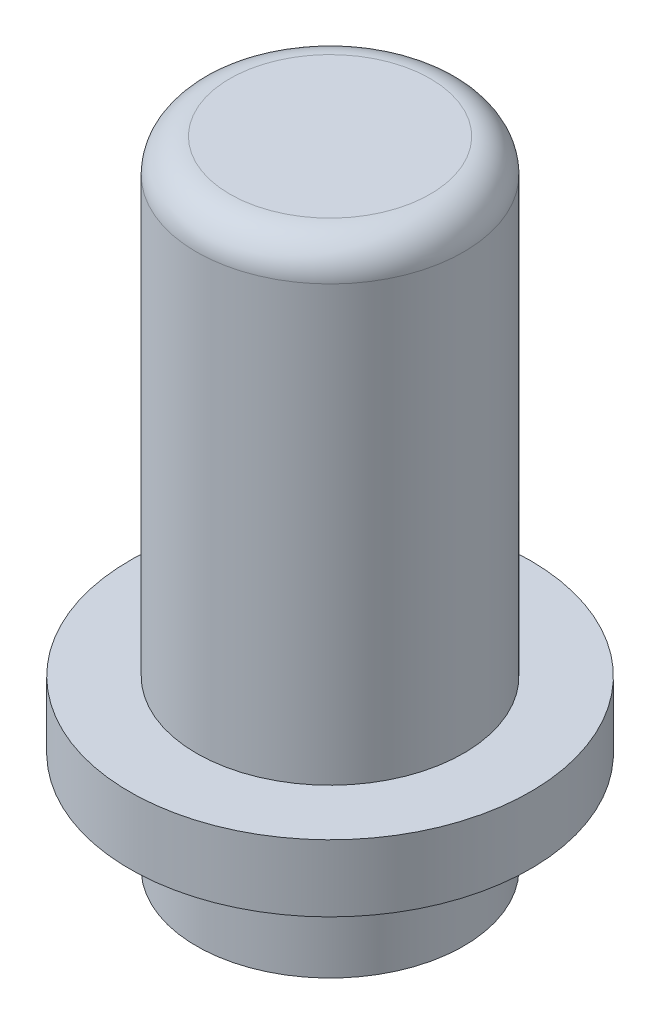
ISO-10303-21;
HEADER;
FILE_DESCRIPTION(('STEP AP214'),'2;1');
FILE_NAME('part.step','',(''),(''),'','','');
FILE_SCHEMA(('AUTOMOTIVE_DESIGN { 1 0 10303 214 1 1 1 1 }'));
ENDSEC;
DATA;
#1=APPLICATION_CONTEXT('core data for automotive mechanical design processes');
#2=APPLICATION_PROTOCOL_DEFINITION('international standard','automotive_design',2000,#1);
#3=PRODUCT_CONTEXT('',#1,'mechanical');
#4=PRODUCT('Part','Part','',(#3));
#5=PRODUCT_RELATED_PRODUCT_CATEGORY('part','',(#4));
#6=PRODUCT_DEFINITION_FORMATION('','',#4);
#7=PRODUCT_DEFINITION_CONTEXT('part definition',#1,'design');
#8=PRODUCT_DEFINITION('design','',#6,#7);
#9=PRODUCT_DEFINITION_SHAPE('','',#8);
#10=(LENGTH_UNIT() NAMED_UNIT(*) SI_UNIT(.MILLI.,.METRE.));
#11=(NAMED_UNIT(*) PLANE_ANGLE_UNIT() SI_UNIT($,.RADIAN.));
#12=(NAMED_UNIT(*) SI_UNIT($,.STERADIAN.) SOLID_ANGLE_UNIT());
#13=UNCERTAINTY_MEASURE_WITH_UNIT(LENGTH_MEASURE(1.E-05),#10,'distance_accuracy_value','');
#14=(GEOMETRIC_REPRESENTATION_CONTEXT(3) GLOBAL_UNCERTAINTY_ASSIGNED_CONTEXT((#13)) GLOBAL_UNIT_ASSIGNED_CONTEXT((#10,
#11,#12)) REPRESENTATION_CONTEXT('',''));
#15=CARTESIAN_POINT('',(0.,0.,0.));
#16=DIRECTION('',(0.,0.,1.));
#17=DIRECTION('',(1.,0.,0.));
#18=AXIS2_PLACEMENT_3D('',#15,#16,#17);
#19=CARTESIAN_POINT('',(0.,6.5,0.));
#20=DIRECTION('',(0.,1.,0.));
#21=DIRECTION('',(0.,0.,1.));
#22=AXIS2_PLACEMENT_3D('',#19,#20,#21);
#23=TOROIDAL_SURFACE('',#22,1.5,0.5);
#24=CARTESIAN_POINT('',(0.,7.,0.));
#25=DIRECTION('',(0.,1.,0.));
#26=DIRECTION('',(0.,0.,1.));
#27=AXIS2_PLACEMENT_3D('',#24,#25,#26);
#28=CIRCLE('',#27,1.5);
#29=CARTESIAN_POINT('',(0.,7.,1.5));
#30=VERTEX_POINT('',#29);
#31=EDGE_CURVE('E152',#30,#30,#28,.T.);
#32=ORIENTED_EDGE('',*,*,#31,.F.);
#33=EDGE_LOOP('',(#32));
#34=FACE_BOUND('',#33,.T.);
#35=CARTESIAN_POINT('',(0.,6.5,0.));
#36=DIRECTION('',(0.,1.,0.));
#37=DIRECTION('',(0.,0.,1.));
#38=AXIS2_PLACEMENT_3D('',#35,#36,#37);
#39=CIRCLE('',#38,2.);
#40=CARTESIAN_POINT('',(0.,6.5,2.));
#41=VERTEX_POINT('',#40);
#42=EDGE_CURVE('E37',#41,#41,#39,.F.);
#43=ORIENTED_EDGE('',*,*,#42,.F.);
#44=EDGE_LOOP('',(#43));
#45=FACE_BOUND('',#44,.T.);
#46=ADVANCED_FACE('F34',(#34,#45),#23,.T.);
#47=CARTESIAN_POINT('',(0.,7.,0.));
#48=DIRECTION('',(0.,-1.,0.));
#49=DIRECTION('',(0.,0.,-1.));
#50=AXIS2_PLACEMENT_3D('',#47,#48,#49);
#51=CYLINDRICAL_SURFACE('',#50,2.);
#52=ORIENTED_EDGE('',*,*,#42,.T.);
#53=EDGE_LOOP('',(#52));
#54=FACE_BOUND('',#53,.T.);
#55=CARTESIAN_POINT('',(0.,0.,0.));
#56=DIRECTION('',(0.,1.,0.));
#57=DIRECTION('',(0.,0.,1.));
#58=AXIS2_PLACEMENT_3D('',#55,#56,#57);
#59=CIRCLE('',#58,2.);
#60=CARTESIAN_POINT('',(0.,0.,2.));
#61=VERTEX_POINT('',#60);
#62=EDGE_CURVE('E148',#61,#61,#59,.T.);
#63=ORIENTED_EDGE('',*,*,#62,.T.);
#64=EDGE_LOOP('',(#63));
#65=FACE_BOUND('',#64,.T.);
#66=ADVANCED_FACE('F159',(#54,#65),#51,.T.);
#67=CARTESIAN_POINT('',(0.,7.,0.));
#68=DIRECTION('',(0.,1.,0.));
#69=DIRECTION('',(0.,0.,1.));
#70=AXIS2_PLACEMENT_3D('',#67,#68,#69);
#71=PLANE('',#70);
#72=ORIENTED_EDGE('',*,*,#31,.T.);
#73=EDGE_LOOP('',(#72));
#74=FACE_BOUND('',#73,.T.);
#75=ADVANCED_FACE('F167',(#74),#71,.T.);
#76=CARTESIAN_POINT('',(0.,-1.,0.));
#77=DIRECTION('',(0.,1.,0.));
#78=DIRECTION('',(0.,0.,1.));
#79=AXIS2_PLACEMENT_3D('',#76,#77,#78);
#80=CYLINDRICAL_SURFACE('',#79,3.);
#81=CARTESIAN_POINT('',(0.,-1.,0.));
#82=DIRECTION('',(0.,-1.,0.));
#83=DIRECTION('',(0.,0.,-1.));
#84=AXIS2_PLACEMENT_3D('',#81,#82,#83);
#85=CIRCLE('',#84,3.);
#86=CARTESIAN_POINT('',(0.,-1.,-3.));
#87=VERTEX_POINT('',#86);
#88=EDGE_CURVE('E145',#87,#87,#85,.T.);
#89=ORIENTED_EDGE('',*,*,#88,.F.);
#90=EDGE_LOOP('',(#89));
#91=FACE_BOUND('',#90,.T.);
#92=CARTESIAN_POINT('',(0.,0.,0.));
#93=DIRECTION('',(0.,-1.,0.));
#94=DIRECTION('',(0.,0.,-1.));
#95=AXIS2_PLACEMENT_3D('',#92,#93,#94);
#96=CIRCLE('',#95,3.);
#97=CARTESIAN_POINT('',(0.,0.,-3.));
#98=VERTEX_POINT('',#97);
#99=EDGE_CURVE('E143',#98,#98,#96,.T.);
#100=ORIENTED_EDGE('',*,*,#99,.T.);
#101=EDGE_LOOP('',(#100));
#102=FACE_BOUND('',#101,.T.);
#103=ADVANCED_FACE('F171',(#91,#102),#80,.T.);
#104=CARTESIAN_POINT('',(0.,-1.,0.));
#105=DIRECTION('',(0.,-1.,0.));
#106=DIRECTION('',(0.,0.,-1.));
#107=AXIS2_PLACEMENT_3D('',#104,#105,#106);
#108=PLANE('',#107);
#109=CARTESIAN_POINT('',(0.,-1.,0.));
#110=DIRECTION('',(0.,-1.,0.));
#111=DIRECTION('',(0.,0.,-1.));
#112=AXIS2_PLACEMENT_3D('',#109,#110,#111);
#113=CIRCLE('',#112,2.);
#114=CARTESIAN_POINT('',(0.,-1.,-2.));
#115=VERTEX_POINT('',#114);
#116=EDGE_CURVE('E11',#115,#115,#113,.T.);
#117=ORIENTED_EDGE('',*,*,#116,.F.);
#118=EDGE_LOOP('',(#117));
#119=FACE_BOUND('',#118,.T.);
#120=ORIENTED_EDGE('',*,*,#88,.T.);
#121=EDGE_LOOP('',(#120));
#122=FACE_BOUND('',#121,.T.);
#123=ADVANCED_FACE('F176',(#119,#122),#108,.T.);
#124=CARTESIAN_POINT('',(0.,0.,0.));
#125=DIRECTION('',(0.,-1.,0.));
#126=DIRECTION('',(0.,0.,-1.));
#127=AXIS2_PLACEMENT_3D('',#124,#125,#126);
#128=PLANE('',#127);
#129=ORIENTED_EDGE('',*,*,#62,.F.);
#130=EDGE_LOOP('',(#129));
#131=FACE_BOUND('',#130,.T.);
#132=ORIENTED_EDGE('',*,*,#99,.F.);
#133=EDGE_LOOP('',(#132));
#134=FACE_BOUND('',#133,.T.);
#135=ADVANCED_FACE('F178',(#131,#134),#128,.F.);
#136=CARTESIAN_POINT('',(0.,-2.5,0.));
#137=DIRECTION('',(0.,1.,0.));
#138=DIRECTION('',(0.,0.,1.));
#139=AXIS2_PLACEMENT_3D('',#136,#137,#138);
#140=CYLINDRICAL_SURFACE('',#139,2.);
#141=CARTESIAN_POINT('',(0.,-2.5,0.));
#142=DIRECTION('',(0.,-1.,0.));
#143=DIRECTION('',(0.,0.,-1.));
#144=AXIS2_PLACEMENT_3D('',#141,#142,#143);
#145=CIRCLE('',#144,2.);
#146=CARTESIAN_POINT('',(0.,-2.5,-2.));
#147=VERTEX_POINT('',#146);
#148=EDGE_CURVE('E136',#147,#147,#145,.T.);
#149=ORIENTED_EDGE('',*,*,#148,.F.);
#150=EDGE_LOOP('',(#149));
#151=FACE_BOUND('',#150,.T.);
#152=ORIENTED_EDGE('',*,*,#116,.T.);
#153=EDGE_LOOP('',(#152));
#154=FACE_BOUND('',#153,.T.);
#155=ADVANCED_FACE('F181',(#151,#154),#140,.T.);
#156=CARTESIAN_POINT('',(0.,-2.5,0.));
#157=DIRECTION('',(0.,-1.,0.));
#158=DIRECTION('',(0.,0.,-1.));
#159=AXIS2_PLACEMENT_3D('',#156,#157,#158);
#160=PLANE('',#159);
#161=DIRECTION('',(-0.5,0.,0.866025403784438));
#162=VECTOR('',#161,1.);
#163=CARTESIAN_POINT('',(1.73205080756888,-2.5,0.));
#164=LINE('',#163,#162);
#165=CARTESIAN_POINT('',(1.73205080756888,-2.5,0.));
#166=VERTEX_POINT('',#165);
#167=CARTESIAN_POINT('',(0.866025403784438,-2.5,1.5));
#168=VERTEX_POINT('',#167);
#169=EDGE_CURVE('E49',#166,#168,#164,.T.);
#170=ORIENTED_EDGE('',*,*,#169,.F.);
#171=DIRECTION('',(0.5,0.,0.866025403784439));
#172=VECTOR('',#171,1.);
#173=CARTESIAN_POINT('',(0.866025403784438,-2.5,-1.5));
#174=LINE('',#173,#172);
#175=CARTESIAN_POINT('',(0.866025403784438,-2.5,-1.5));
#176=VERTEX_POINT('',#175);
#177=EDGE_CURVE('E132',#176,#166,#174,.T.);
#178=ORIENTED_EDGE('',*,*,#177,.F.);
#179=DIRECTION('',(1.,0.,0.));
#180=VECTOR('',#179,1.);
#181=CARTESIAN_POINT('',(-0.866025403784439,-2.5,-1.5));
#182=LINE('',#181,#180);
#183=CARTESIAN_POINT('',(-0.866025403784439,-2.5,-1.5));
#184=VERTEX_POINT('',#183);
#185=EDGE_CURVE('E130',#184,#176,#182,.T.);
#186=ORIENTED_EDGE('',*,*,#185,.F.);
#187=DIRECTION('',(0.5,0.,-0.866025403784439));
#188=VECTOR('',#187,1.);
#189=CARTESIAN_POINT('',(-1.73205080756888,-2.5,0.));
#190=LINE('',#189,#188);
#191=CARTESIAN_POINT('',(-1.73205080756888,-2.5,0.));
#192=VERTEX_POINT('',#191);
#193=EDGE_CURVE('E97',#192,#184,#190,.T.);
#194=ORIENTED_EDGE('',*,*,#193,.F.);
#195=DIRECTION('',(-0.5,0.,-0.866025403784439));
#196=VECTOR('',#195,1.);
#197=CARTESIAN_POINT('',(-0.866025403784439,-2.5,1.5));
#198=LINE('',#197,#196);
#199=CARTESIAN_POINT('',(-0.866025403784439,-2.5,1.5));
#200=VERTEX_POINT('',#199);
#201=EDGE_CURVE('E126',#200,#192,#198,.T.);
#202=ORIENTED_EDGE('',*,*,#201,.F.);
#203=DIRECTION('',(-1.,0.,0.));
#204=VECTOR('',#203,1.);
#205=CARTESIAN_POINT('',(0.866025403784438,-2.5,1.5));
#206=LINE('',#205,#204);
#207=EDGE_CURVE('E123',#168,#200,#206,.T.);
#208=ORIENTED_EDGE('',*,*,#207,.F.);
#209=EDGE_LOOP('',(#170,#178,#186,#194,#202,#208));
#210=FACE_BOUND('',#209,.T.);
#211=ORIENTED_EDGE('',*,*,#148,.T.);
#212=EDGE_LOOP('',(#211));
#213=FACE_BOUND('',#212,.T.);
#214=ADVANCED_FACE('F188',(#210,#213),#160,.T.);
#215=CARTESIAN_POINT('',(1.73205080756888,-0.5,0.));
#216=DIRECTION('',(0.866025403784438,0.,0.5));
#217=DIRECTION('',(0.5,0.,-0.866025403784439));
#218=AXIS2_PLACEMENT_3D('',#215,#216,#217);
#219=PLANE('',#218);
#220=ORIENTED_EDGE('',*,*,#169,.T.);
#221=DIRECTION('',(0.,-1.,0.));
#222=VECTOR('',#221,1.);
#223=CARTESIAN_POINT('',(0.866025403784438,-0.5,1.5));
#224=LINE('',#223,#222);
#225=CARTESIAN_POINT('',(0.866025403784438,-0.5,1.5));
#226=VERTEX_POINT('',#225);
#227=EDGE_CURVE('E79',#226,#168,#224,.T.);
#228=ORIENTED_EDGE('',*,*,#227,.F.);
#229=DIRECTION('',(-0.5,0.,0.866025403784438));
#230=VECTOR('',#229,1.);
#231=CARTESIAN_POINT('',(1.73205080756888,-0.5,0.));
#232=LINE('',#231,#230);
#233=CARTESIAN_POINT('',(1.73205080756888,-0.5,0.));
#234=VERTEX_POINT('',#233);
#235=EDGE_CURVE('E134',#234,#226,#232,.T.);
#236=ORIENTED_EDGE('',*,*,#235,.F.);
#237=DIRECTION('',(0.,-1.,0.));
#238=VECTOR('',#237,1.);
#239=CARTESIAN_POINT('',(1.73205080756888,-0.5,0.));
#240=LINE('',#239,#238);
#241=EDGE_CURVE('E57',#234,#166,#240,.T.);
#242=ORIENTED_EDGE('',*,*,#241,.T.);
#243=EDGE_LOOP('',(#220,#228,#236,#242));
#244=FACE_BOUND('',#243,.T.);
#245=ADVANCED_FACE('F192',(#244),#219,.F.);
#246=CARTESIAN_POINT('',(0.866025403784438,-0.5,-1.5));
#247=DIRECTION('',(0.866025403784439,0.,-0.5));
#248=DIRECTION('',(-0.5,0.,-0.866025403784439));
#249=AXIS2_PLACEMENT_3D('',#246,#247,#248);
#250=PLANE('',#249);
#251=ORIENTED_EDGE('',*,*,#177,.T.);
#252=ORIENTED_EDGE('',*,*,#241,.F.);
#253=DIRECTION('',(0.5,0.,0.866025403784439));
#254=VECTOR('',#253,1.);
#255=CARTESIAN_POINT('',(0.866025403784438,-0.5,-1.5));
#256=LINE('',#255,#254);
#257=CARTESIAN_POINT('',(0.866025403784438,-0.5,-1.5));
#258=VERTEX_POINT('',#257);
#259=EDGE_CURVE('E109',#258,#234,#256,.T.);
#260=ORIENTED_EDGE('',*,*,#259,.F.);
#261=DIRECTION('',(0.,-1.,0.));
#262=VECTOR('',#261,1.);
#263=CARTESIAN_POINT('',(0.866025403784438,-0.5,-1.5));
#264=LINE('',#263,#262);
#265=EDGE_CURVE('E101',#258,#176,#264,.T.);
#266=ORIENTED_EDGE('',*,*,#265,.T.);
#267=EDGE_LOOP('',(#251,#252,#260,#266));
#268=FACE_BOUND('',#267,.T.);
#269=ADVANCED_FACE('F196',(#268),#250,.F.);
#270=CARTESIAN_POINT('',(-0.866025403784439,-0.5,-1.5));
#271=DIRECTION('',(0.,0.,-1.));
#272=DIRECTION('',(-1.,0.,0.));
#273=AXIS2_PLACEMENT_3D('',#270,#271,#272);
#274=PLANE('',#273);
#275=ORIENTED_EDGE('',*,*,#185,.T.);
#276=ORIENTED_EDGE('',*,*,#265,.F.);
#277=DIRECTION('',(1.,0.,0.));
#278=VECTOR('',#277,1.);
#279=CARTESIAN_POINT('',(-0.866025403784439,-0.5,-1.5));
#280=LINE('',#279,#278);
#281=CARTESIAN_POINT('',(-0.866025403784439,-0.5,-1.5));
#282=VERTEX_POINT('',#281);
#283=EDGE_CURVE('E105',#282,#258,#280,.T.);
#284=ORIENTED_EDGE('',*,*,#283,.F.);
#285=DIRECTION('',(0.,-1.,0.));
#286=VECTOR('',#285,1.);
#287=CARTESIAN_POINT('',(-0.866025403784439,-0.5,-1.5));
#288=LINE('',#287,#286);
#289=EDGE_CURVE('E90',#282,#184,#288,.T.);
#290=ORIENTED_EDGE('',*,*,#289,.T.);
#291=EDGE_LOOP('',(#275,#276,#284,#290));
#292=FACE_BOUND('',#291,.T.);
#293=ADVANCED_FACE('F106',(#292),#274,.F.);
#294=CARTESIAN_POINT('',(-1.73205080756888,-0.5,0.));
#295=DIRECTION('',(-0.866025403784439,0.,-0.5));
#296=DIRECTION('',(-0.5,0.,0.866025403784439));
#297=AXIS2_PLACEMENT_3D('',#294,#295,#296);
#298=PLANE('',#297);
#299=ORIENTED_EDGE('',*,*,#193,.T.);
#300=ORIENTED_EDGE('',*,*,#289,.F.);
#301=DIRECTION('',(0.5,0.,-0.866025403784439));
#302=VECTOR('',#301,1.);
#303=CARTESIAN_POINT('',(-1.73205080756888,-0.5,0.));
#304=LINE('',#303,#302);
#305=CARTESIAN_POINT('',(-1.73205080756888,-0.5,0.));
#306=VERTEX_POINT('',#305);
#307=EDGE_CURVE('E94',#306,#282,#304,.T.);
#308=ORIENTED_EDGE('',*,*,#307,.F.);
#309=DIRECTION('',(0.,-1.,0.));
#310=VECTOR('',#309,1.);
#311=CARTESIAN_POINT('',(-1.73205080756888,-0.5,0.));
#312=LINE('',#311,#310);
#313=EDGE_CURVE('E102',#306,#192,#312,.T.);
#314=ORIENTED_EDGE('',*,*,#313,.T.);
#315=EDGE_LOOP('',(#299,#300,#308,#314));
#316=FACE_BOUND('',#315,.T.);
#317=ADVANCED_FACE('F92',(#316),#298,.F.);
#318=CARTESIAN_POINT('',(-0.866025403784439,-0.5,1.5));
#319=DIRECTION('',(-0.866025403784439,0.,0.5));
#320=DIRECTION('',(0.5,0.,0.866025403784439));
#321=AXIS2_PLACEMENT_3D('',#318,#319,#320);
#322=PLANE('',#321);
#323=ORIENTED_EDGE('',*,*,#201,.T.);
#324=ORIENTED_EDGE('',*,*,#313,.F.);
#325=DIRECTION('',(-0.5,0.,-0.866025403784439));
#326=VECTOR('',#325,1.);
#327=CARTESIAN_POINT('',(-0.866025403784439,-0.5,1.5));
#328=LINE('',#327,#326);
#329=CARTESIAN_POINT('',(-0.866025403784439,-0.5,1.5));
#330=VERTEX_POINT('',#329);
#331=EDGE_CURVE('E115',#330,#306,#328,.T.);
#332=ORIENTED_EDGE('',*,*,#331,.F.);
#333=DIRECTION('',(0.,-1.,0.));
#334=VECTOR('',#333,1.);
#335=CARTESIAN_POINT('',(-0.866025403784439,-0.5,1.5));
#336=LINE('',#335,#334);
#337=EDGE_CURVE('E139',#330,#200,#336,.T.);
#338=ORIENTED_EDGE('',*,*,#337,.T.);
#339=EDGE_LOOP('',(#323,#324,#332,#338));
#340=FACE_BOUND('',#339,.T.);
#341=ADVANCED_FACE('F200',(#340),#322,.F.);
#342=CARTESIAN_POINT('',(0.866025403784438,-0.5,1.5));
#343=DIRECTION('',(0.,0.,1.));
#344=DIRECTION('',(1.,0.,0.));
#345=AXIS2_PLACEMENT_3D('',#342,#343,#344);
#346=PLANE('',#345);
#347=ORIENTED_EDGE('',*,*,#207,.T.);
#348=ORIENTED_EDGE('',*,*,#337,.F.);
#349=DIRECTION('',(-1.,0.,0.));
#350=VECTOR('',#349,1.);
#351=CARTESIAN_POINT('',(0.866025403784438,-0.5,1.5));
#352=LINE('',#351,#350);
#353=EDGE_CURVE('E117',#226,#330,#352,.T.);
#354=ORIENTED_EDGE('',*,*,#353,.F.);
#355=ORIENTED_EDGE('',*,*,#227,.T.);
#356=EDGE_LOOP('',(#347,#348,#354,#355));
#357=FACE_BOUND('',#356,.T.);
#358=ADVANCED_FACE('F197',(#357),#346,.F.);
#359=CARTESIAN_POINT('',(0.,-0.5,0.));
#360=DIRECTION('',(0.,-1.,0.));
#361=DIRECTION('',(0.,0.,-1.));
#362=AXIS2_PLACEMENT_3D('',#359,#360,#361);
#363=PLANE('',#362);
#364=ORIENTED_EDGE('',*,*,#235,.T.);
#365=ORIENTED_EDGE('',*,*,#353,.T.);
#366=ORIENTED_EDGE('',*,*,#331,.T.);
#367=ORIENTED_EDGE('',*,*,#307,.T.);
#368=ORIENTED_EDGE('',*,*,#283,.T.);
#369=ORIENTED_EDGE('',*,*,#259,.T.);
#370=EDGE_LOOP('',(#364,#365,#366,#367,#368,#369));
#371=FACE_BOUND('',#370,.T.);
#372=ADVANCED_FACE('F112',(#371),#363,.T.);
#373=CLOSED_SHELL('',(#46,#66,#75,#103,#123,#135,#155,#214,#245,#269,#293,#317,#341,#358,#372));
#374=MANIFOLD_SOLID_BREP('B2',#373);
#375=ADVANCED_BREP_SHAPE_REPRESENTATION('',(#18,#374),#14);
#376=SHAPE_DEFINITION_REPRESENTATION(#9,#375);
ENDSEC;
END-ISO-10303-21;
